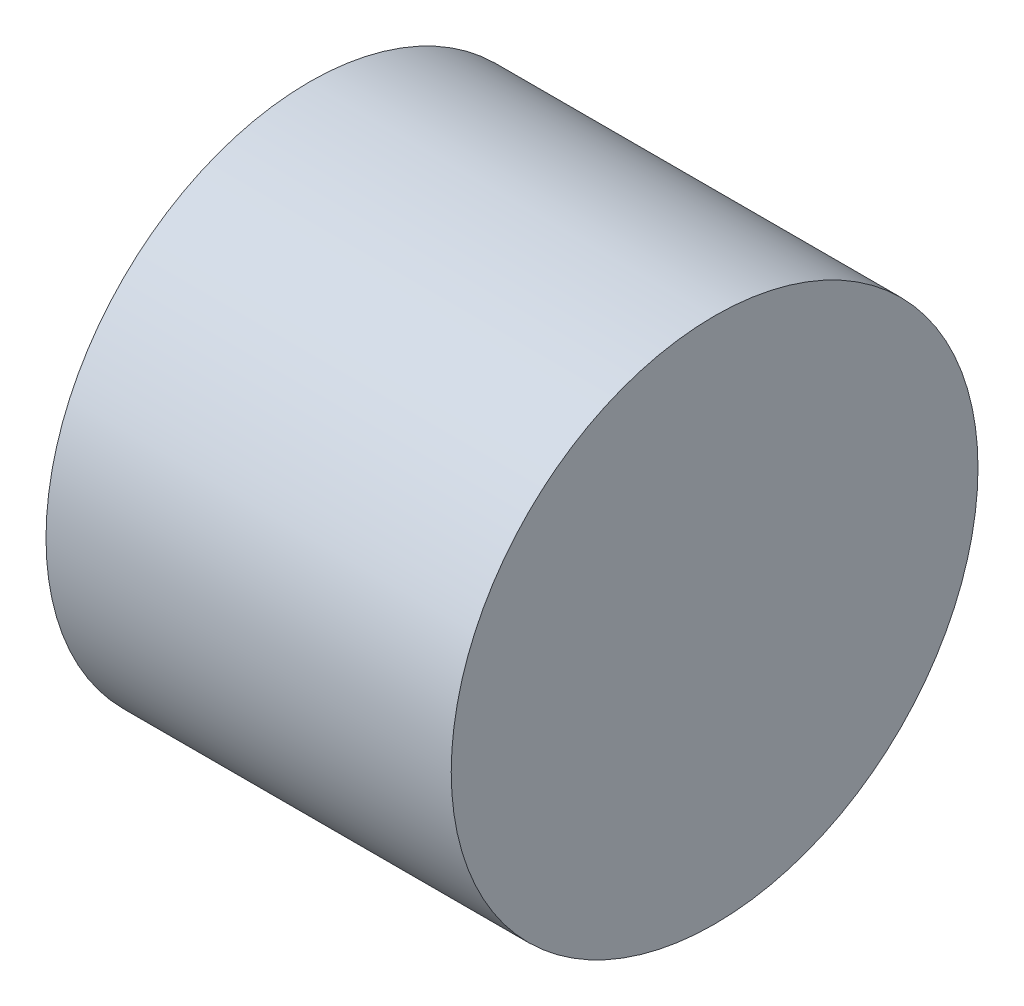
ISO-10303-21;
HEADER;
FILE_DESCRIPTION(('STEP AP214'),'2;1');
FILE_NAME('part.step','',(''),(''),'','','');
FILE_SCHEMA(('AUTOMOTIVE_DESIGN { 1 0 10303 214 1 1 1 1 }'));
ENDSEC;
DATA;
#1=APPLICATION_CONTEXT('core data for automotive mechanical design processes');
#2=APPLICATION_PROTOCOL_DEFINITION('international standard','automotive_design',2000,#1);
#3=PRODUCT_CONTEXT('',#1,'mechanical');
#4=PRODUCT('Part','Part','',(#3));
#5=PRODUCT_RELATED_PRODUCT_CATEGORY('part','',(#4));
#6=PRODUCT_DEFINITION_FORMATION('','',#4);
#7=PRODUCT_DEFINITION_CONTEXT('part definition',#1,'design');
#8=PRODUCT_DEFINITION('design','',#6,#7);
#9=PRODUCT_DEFINITION_SHAPE('','',#8);
#10=(LENGTH_UNIT() NAMED_UNIT(*) SI_UNIT(.MILLI.,.METRE.));
#11=(NAMED_UNIT(*) PLANE_ANGLE_UNIT() SI_UNIT($,.RADIAN.));
#12=(NAMED_UNIT(*) SI_UNIT($,.STERADIAN.) SOLID_ANGLE_UNIT());
#13=UNCERTAINTY_MEASURE_WITH_UNIT(LENGTH_MEASURE(1.E-05),#10,'distance_accuracy_value','');
#14=(GEOMETRIC_REPRESENTATION_CONTEXT(3) GLOBAL_UNCERTAINTY_ASSIGNED_CONTEXT((#13)) GLOBAL_UNIT_ASSIGNED_CONTEXT((#10,
#11,#12)) REPRESENTATION_CONTEXT('',''));
#15=CARTESIAN_POINT('',(0.,0.,0.));
#16=DIRECTION('',(0.,0.,1.));
#17=DIRECTION('',(1.,0.,0.));
#18=AXIS2_PLACEMENT_3D('',#15,#16,#17);
#19=CARTESIAN_POINT('',(50.,0.,0.));
#20=DIRECTION('',(1.,0.,0.));
#21=DIRECTION('',(0.,0.,-1.));
#22=AXIS2_PLACEMENT_3D('',#19,#20,#21);
#23=PLANE('',#22);
#24=CARTESIAN_POINT('',(50.,0.,0.));
#25=DIRECTION('',(-1.,0.,0.));
#26=DIRECTION('',(0.,0.,1.));
#27=AXIS2_PLACEMENT_3D('',#24,#25,#26);
#28=CIRCLE('',#27,32.5);
#29=CARTESIAN_POINT('',(50.,0.,32.5));
#30=VERTEX_POINT('',#29);
#31=EDGE_CURVE('E18',#30,#30,#28,.T.);
#32=ORIENTED_EDGE('',*,*,#31,.F.);
#33=EDGE_LOOP('',(#32));
#34=FACE_BOUND('',#33,.T.);
#35=ADVANCED_FACE('F15',(#34),#23,.T.);
#36=CARTESIAN_POINT('',(0.,0.,0.));
#37=DIRECTION('',(1.,0.,0.));
#38=DIRECTION('',(0.,0.,-1.));
#39=AXIS2_PLACEMENT_3D('',#36,#37,#38);
#40=PLANE('',#39);
#41=CARTESIAN_POINT('',(0.,0.,0.));
#42=DIRECTION('',(-1.,0.,0.));
#43=DIRECTION('',(0.,0.,1.));
#44=AXIS2_PLACEMENT_3D('',#41,#42,#43);
#45=CIRCLE('',#44,32.5);
#46=CARTESIAN_POINT('',(0.,0.,32.5));
#47=VERTEX_POINT('',#46);
#48=EDGE_CURVE('E10',#47,#47,#45,.F.);
#49=ORIENTED_EDGE('',*,*,#48,.F.);
#50=EDGE_LOOP('',(#49));
#51=FACE_BOUND('',#50,.T.);
#52=ADVANCED_FACE('F30',(#51),#40,.F.);
#53=CARTESIAN_POINT('',(50.,0.,0.));
#54=DIRECTION('',(-1.,0.,0.));
#55=DIRECTION('',(0.,0.,1.));
#56=AXIS2_PLACEMENT_3D('',#53,#54,#55);
#57=CYLINDRICAL_SURFACE('',#56,32.5);
#58=ORIENTED_EDGE('',*,*,#31,.T.);
#59=EDGE_LOOP('',(#58));
#60=FACE_BOUND('',#59,.T.);
#61=ORIENTED_EDGE('',*,*,#48,.T.);
#62=EDGE_LOOP('',(#61));
#63=FACE_BOUND('',#62,.T.);
#64=ADVANCED_FACE('F27',(#60,#63),#57,.T.);
#65=CLOSED_SHELL('',(#35,#52,#64));
#66=MANIFOLD_SOLID_BREP('B1',#65);
#67=ADVANCED_BREP_SHAPE_REPRESENTATION('',(#18,#66),#14);
#68=SHAPE_DEFINITION_REPRESENTATION(#9,#67);
ENDSEC;
END-ISO-10303-21;
